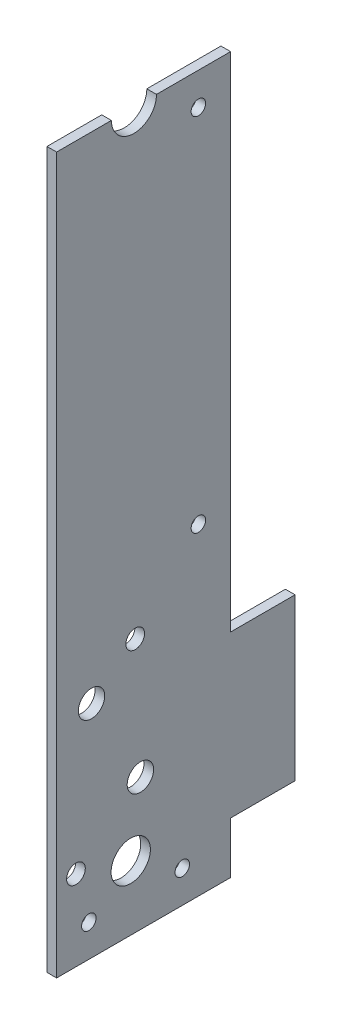
ISO-10303-21;
HEADER;
FILE_DESCRIPTION(('STEP AP214'),'2;1');
FILE_NAME('part.step','',(''),(''),'','','');
FILE_SCHEMA(('AUTOMOTIVE_DESIGN { 1 0 10303 214 1 1 1 1 }'));
ENDSEC;
DATA;
#1=APPLICATION_CONTEXT('core data for automotive mechanical design processes');
#2=APPLICATION_PROTOCOL_DEFINITION('international standard','automotive_design',2000,#1);
#3=PRODUCT_CONTEXT('',#1,'mechanical');
#4=PRODUCT('Part','Part','',(#3));
#5=PRODUCT_RELATED_PRODUCT_CATEGORY('part','',(#4));
#6=PRODUCT_DEFINITION_FORMATION('','',#4);
#7=PRODUCT_DEFINITION_CONTEXT('part definition',#1,'design');
#8=PRODUCT_DEFINITION('design','',#6,#7);
#9=PRODUCT_DEFINITION_SHAPE('','',#8);
#10=(LENGTH_UNIT() NAMED_UNIT(*) SI_UNIT(.MILLI.,.METRE.));
#11=(NAMED_UNIT(*) PLANE_ANGLE_UNIT() SI_UNIT($,.RADIAN.));
#12=(NAMED_UNIT(*) SI_UNIT($,.STERADIAN.) SOLID_ANGLE_UNIT());
#13=UNCERTAINTY_MEASURE_WITH_UNIT(LENGTH_MEASURE(1.E-05),#10,'distance_accuracy_value','');
#14=(GEOMETRIC_REPRESENTATION_CONTEXT(3) GLOBAL_UNCERTAINTY_ASSIGNED_CONTEXT((#13)) GLOBAL_UNIT_ASSIGNED_CONTEXT((#10,
#11,#12)) REPRESENTATION_CONTEXT('',''));
#15=CARTESIAN_POINT('',(0.,0.,0.));
#16=DIRECTION('',(0.,0.,1.));
#17=DIRECTION('',(1.,0.,0.));
#18=AXIS2_PLACEMENT_3D('',#15,#16,#17);
#19=CARTESIAN_POINT('',(0.,52.,24.));
#20=DIRECTION('',(0.,1.,0.));
#21=DIRECTION('',(0.,0.,1.));
#22=AXIS2_PLACEMENT_3D('',#19,#20,#21);
#23=PLANE('',#22);
#24=DIRECTION('',(1.,0.,0.));
#25=VECTOR('',#24,1.);
#26=CARTESIAN_POINT('',(-1.8,52.,61.));
#27=LINE('',#26,#25);
#28=CARTESIAN_POINT('',(-1.5,52.,61.));
#29=VERTEX_POINT('',#28);
#30=CARTESIAN_POINT('',(1.5,52.,61.));
#31=VERTEX_POINT('',#30);
#32=EDGE_CURVE('E30',#29,#31,#27,.T.);
#33=ORIENTED_EDGE('',*,*,#32,.F.);
#34=DIRECTION('',(0.,0.,1.));
#35=VECTOR('',#34,1.);
#36=CARTESIAN_POINT('',(-1.5,52.,24.));
#37=LINE('',#36,#35);
#38=CARTESIAN_POINT('',(-1.5,52.,78.));
#39=VERTEX_POINT('',#38);
#40=EDGE_CURVE('E108',#29,#39,#37,.T.);
#41=ORIENTED_EDGE('',*,*,#40,.T.);
#42=DIRECTION('',(1.,0.,0.));
#43=VECTOR('',#42,1.);
#44=CARTESIAN_POINT('',(0.,52.,78.));
#45=LINE('',#44,#43);
#46=CARTESIAN_POINT('',(1.5,52.,78.));
#47=VERTEX_POINT('',#46);
#48=EDGE_CURVE('E122',#39,#47,#45,.T.);
#49=ORIENTED_EDGE('',*,*,#48,.T.);
#50=DIRECTION('',(0.,0.,1.));
#51=VECTOR('',#50,1.);
#52=CARTESIAN_POINT('',(1.5,52.,24.));
#53=LINE('',#52,#51);
#54=EDGE_CURVE('E109',#31,#47,#53,.T.);
#55=ORIENTED_EDGE('',*,*,#54,.F.);
#56=EDGE_LOOP('',(#33,#41,#49,#55));
#57=FACE_BOUND('',#56,.T.);
#58=ADVANCED_FACE('F16',(#57),#23,.T.);
#59=CARTESIAN_POINT('',(0.,-59.,24.));
#60=DIRECTION('',(0.,0.,-1.));
#61=DIRECTION('',(-1.,0.,0.));
#62=AXIS2_PLACEMENT_3D('',#59,#60,#61);
#63=PLANE('',#62);
#64=DIRECTION('',(-1.,0.,0.));
#65=VECTOR('',#64,1.);
#66=CARTESIAN_POINT('',(0.,-154.,24.));
#67=LINE('',#66,#65);
#68=CARTESIAN_POINT('',(1.5,-154.,24.));
#69=VERTEX_POINT('',#68);
#70=CARTESIAN_POINT('',(-1.5,-154.,24.));
#71=VERTEX_POINT('',#70);
#72=EDGE_CURVE('E208',#69,#71,#67,.T.);
#73=ORIENTED_EDGE('',*,*,#72,.F.);
#74=DIRECTION('',(0.,1.,0.));
#75=VECTOR('',#74,1.);
#76=CARTESIAN_POINT('',(1.5,-59.,24.));
#77=LINE('',#76,#75);
#78=CARTESIAN_POINT('',(1.5,-170.,24.));
#79=VERTEX_POINT('',#78);
#80=EDGE_CURVE('E214',#79,#69,#77,.T.);
#81=ORIENTED_EDGE('',*,*,#80,.F.);
#82=DIRECTION('',(1.,0.,0.));
#83=VECTOR('',#82,1.);
#84=CARTESIAN_POINT('',(0.,-170.,24.));
#85=LINE('',#84,#83);
#86=CARTESIAN_POINT('',(-1.5,-170.,24.));
#87=VERTEX_POINT('',#86);
#88=EDGE_CURVE('E210',#87,#79,#85,.T.);
#89=ORIENTED_EDGE('',*,*,#88,.F.);
#90=DIRECTION('',(0.,-1.,0.));
#91=VECTOR('',#90,1.);
#92=CARTESIAN_POINT('',(-1.5,-59.,24.));
#93=LINE('',#92,#91);
#94=EDGE_CURVE('E213',#71,#87,#93,.T.);
#95=ORIENTED_EDGE('',*,*,#94,.F.);
#96=EDGE_LOOP('',(#73,#81,#89,#95));
#97=FACE_BOUND('',#96,.T.);
#98=ADVANCED_FACE('F234',(#97),#63,.T.);
#99=CARTESIAN_POINT('',(0.,-59.,78.));
#100=DIRECTION('',(0.,0.,1.));
#101=DIRECTION('',(1.,0.,0.));
#102=AXIS2_PLACEMENT_3D('',#99,#100,#101);
#103=PLANE('',#102);
#104=DIRECTION('',(-1.,0.,0.));
#105=VECTOR('',#104,1.);
#106=CARTESIAN_POINT('',(0.,-170.,78.));
#107=LINE('',#106,#105);
#108=CARTESIAN_POINT('',(1.5,-170.,78.));
#109=VERTEX_POINT('',#108);
#110=CARTESIAN_POINT('',(-1.5,-170.,78.));
#111=VERTEX_POINT('',#110);
#112=EDGE_CURVE('E24',#109,#111,#107,.T.);
#113=ORIENTED_EDGE('',*,*,#112,.F.);
#114=DIRECTION('',(0.,-1.,0.));
#115=VECTOR('',#114,1.);
#116=CARTESIAN_POINT('',(1.5,-59.,78.));
#117=LINE('',#116,#115);
#118=EDGE_CURVE('E119',#47,#109,#117,.T.);
#119=ORIENTED_EDGE('',*,*,#118,.F.);
#120=ORIENTED_EDGE('',*,*,#48,.F.);
#121=DIRECTION('',(0.,1.,0.));
#122=VECTOR('',#121,1.);
#123=CARTESIAN_POINT('',(-1.5,-59.,78.));
#124=LINE('',#123,#122);
#125=EDGE_CURVE('E125',#111,#39,#124,.T.);
#126=ORIENTED_EDGE('',*,*,#125,.F.);
#127=EDGE_LOOP('',(#113,#119,#120,#126));
#128=FACE_BOUND('',#127,.T.);
#129=ADVANCED_FACE('F18',(#128),#103,.T.);
#130=CARTESIAN_POINT('',(0.,-170.,24.));
#131=DIRECTION('',(0.,-1.,0.));
#132=DIRECTION('',(0.,0.,-1.));
#133=AXIS2_PLACEMENT_3D('',#130,#131,#132);
#134=PLANE('',#133);
#135=DIRECTION('',(0.,0.,1.));
#136=VECTOR('',#135,1.);
#137=CARTESIAN_POINT('',(1.5,-170.,24.));
#138=LINE('',#137,#136);
#139=EDGE_CURVE('E112',#79,#109,#138,.T.);
#140=ORIENTED_EDGE('',*,*,#139,.T.);
#141=ORIENTED_EDGE('',*,*,#112,.T.);
#142=DIRECTION('',(0.,0.,1.));
#143=VECTOR('',#142,1.);
#144=CARTESIAN_POINT('',(-1.5,-170.,24.));
#145=LINE('',#144,#143);
#146=EDGE_CURVE('E116',#87,#111,#145,.T.);
#147=ORIENTED_EDGE('',*,*,#146,.F.);
#148=ORIENTED_EDGE('',*,*,#88,.T.);
#149=EDGE_LOOP('',(#140,#141,#147,#148));
#150=FACE_BOUND('',#149,.T.);
#151=ADVANCED_FACE('F231',(#150),#134,.T.);
#152=CARTESIAN_POINT('',(-1.5,-59.,24.));
#153=DIRECTION('',(-1.,0.,0.));
#154=DIRECTION('',(0.,0.,1.));
#155=AXIS2_PLACEMENT_3D('',#152,#153,#154);
#156=PLANE('',#155);
#157=CARTESIAN_POINT('',(-1.5,52.,54.));
#158=DIRECTION('',(-1.,0.,0.));
#159=DIRECTION('',(0.,0.,1.));
#160=AXIS2_PLACEMENT_3D('',#157,#158,#159);
#161=CIRCLE('',#160,7.);
#162=CARTESIAN_POINT('',(-1.5,52.,47.));
#163=VERTEX_POINT('',#162);
#164=EDGE_CURVE('E163',#163,#29,#161,.T.);
#165=ORIENTED_EDGE('',*,*,#164,.F.);
#166=CARTESIAN_POINT('',(-1.5,52.,24.));
#167=VERTEX_POINT('',#166);
#168=EDGE_CURVE('E102',#167,#163,#37,.T.);
#169=ORIENTED_EDGE('',*,*,#168,.F.);
#170=CARTESIAN_POINT('',(-1.5,-104.,24.));
#171=VERTEX_POINT('',#170);
#172=EDGE_CURVE('E218',#167,#171,#93,.T.);
#173=ORIENTED_EDGE('',*,*,#172,.T.);
#174=DIRECTION('',(0.,0.,1.));
#175=VECTOR('',#174,1.);
#176=CARTESIAN_POINT('',(-1.5,-104.,4.));
#177=LINE('',#176,#175);
#178=CARTESIAN_POINT('',(-1.5,-104.,4.));
#179=VERTEX_POINT('',#178);
#180=EDGE_CURVE('E201',#179,#171,#177,.T.);
#181=ORIENTED_EDGE('',*,*,#180,.F.);
#182=DIRECTION('',(0.,-1.,0.));
#183=VECTOR('',#182,1.);
#184=CARTESIAN_POINT('',(-1.5,-129.,4.));
#185=LINE('',#184,#183);
#186=CARTESIAN_POINT('',(-1.5,-154.,4.));
#187=VERTEX_POINT('',#186);
#188=EDGE_CURVE('E190',#179,#187,#185,.T.);
#189=ORIENTED_EDGE('',*,*,#188,.T.);
#190=DIRECTION('',(0.,0.,1.));
#191=VECTOR('',#190,1.);
#192=CARTESIAN_POINT('',(-1.5,-154.,4.));
#193=LINE('',#192,#191);
#194=EDGE_CURVE('E203',#187,#71,#193,.T.);
#195=ORIENTED_EDGE('',*,*,#194,.T.);
#196=ORIENTED_EDGE('',*,*,#94,.T.);
#197=ORIENTED_EDGE('',*,*,#146,.T.);
#198=ORIENTED_EDGE('',*,*,#125,.T.);
#199=ORIENTED_EDGE('',*,*,#40,.F.);
#200=EDGE_LOOP('',(#165,#169,#173,#181,#189,#195,#196,#197,#198,#199));
#201=FACE_BOUND('',#200,.T.);
#202=CARTESIAN_POINT('',(-1.5,42.,34.));
#203=DIRECTION('',(-1.,0.,0.));
#204=DIRECTION('',(0.,0.,1.));
#205=AXIS2_PLACEMENT_3D('',#202,#203,#204);
#206=CIRCLE('',#205,2.25);
#207=CARTESIAN_POINT('',(-1.5,42.,36.25));
#208=VERTEX_POINT('',#207);
#209=EDGE_CURVE('E160',#208,#208,#206,.T.);
#210=ORIENTED_EDGE('',*,*,#209,.F.);
#211=EDGE_LOOP('',(#210));
#212=FACE_BOUND('',#211,.T.);
#213=CARTESIAN_POINT('',(-1.5,-70.,34.));
#214=DIRECTION('',(-1.,0.,0.));
#215=DIRECTION('',(0.,0.,1.));
#216=AXIS2_PLACEMENT_3D('',#213,#214,#215);
#217=CIRCLE('',#216,2.25);
#218=CARTESIAN_POINT('',(-1.5,-70.,36.25));
#219=VERTEX_POINT('',#218);
#220=EDGE_CURVE('E157',#219,#219,#217,.T.);
#221=ORIENTED_EDGE('',*,*,#220,.F.);
#222=EDGE_LOOP('',(#221));
#223=FACE_BOUND('',#222,.T.);
#224=CARTESIAN_POINT('',(-1.5,-160.,68.));
#225=DIRECTION('',(-1.,0.,0.));
#226=DIRECTION('',(0.,0.,1.));
#227=AXIS2_PLACEMENT_3D('',#224,#225,#226);
#228=CIRCLE('',#227,2.25);
#229=CARTESIAN_POINT('',(-1.5,-160.,70.25));
#230=VERTEX_POINT('',#229);
#231=EDGE_CURVE('E153',#230,#230,#228,.T.);
#232=ORIENTED_EDGE('',*,*,#231,.F.);
#233=EDGE_LOOP('',(#232));
#234=FACE_BOUND('',#233,.T.);
#235=CARTESIAN_POINT('',(-1.5,-160.,39.));
#236=DIRECTION('',(-1.,0.,0.));
#237=DIRECTION('',(0.,0.,1.));
#238=AXIS2_PLACEMENT_3D('',#235,#236,#237);
#239=CIRCLE('',#238,2.25);
#240=CARTESIAN_POINT('',(-1.5,-160.,41.25));
#241=VERTEX_POINT('',#240);
#242=EDGE_CURVE('E149',#241,#241,#239,.T.);
#243=ORIENTED_EDGE('',*,*,#242,.F.);
#244=EDGE_LOOP('',(#243));
#245=FACE_BOUND('',#244,.T.);
#246=CARTESIAN_POINT('',(-1.5,-145.,72.));
#247=DIRECTION('',(-1.,0.,0.));
#248=DIRECTION('',(0.,0.,1.));
#249=AXIS2_PLACEMENT_3D('',#246,#247,#248);
#250=CIRCLE('',#249,2.9);
#251=CARTESIAN_POINT('',(-1.5,-145.,74.9));
#252=VERTEX_POINT('',#251);
#253=EDGE_CURVE('E145',#252,#252,#250,.T.);
#254=ORIENTED_EDGE('',*,*,#253,.F.);
#255=EDGE_LOOP('',(#254));
#256=FACE_BOUND('',#255,.T.);
#257=CARTESIAN_POINT('',(-1.5,-91.033973073178,53.6064866609543));
#258=DIRECTION('',(-1.,0.,0.));
#259=DIRECTION('',(0.,0.,1.));
#260=AXIS2_PLACEMENT_3D('',#257,#258,#259);
#261=CIRCLE('',#260,2.9);
#262=CARTESIAN_POINT('',(-1.5,-91.033973073178,56.5064866609543));
#263=VERTEX_POINT('',#262);
#264=EDGE_CURVE('E141',#263,#263,#261,.T.);
#265=ORIENTED_EDGE('',*,*,#264,.F.);
#266=EDGE_LOOP('',(#265));
#267=FACE_BOUND('',#266,.T.);
#268=CARTESIAN_POINT('',(-1.5,-101.61689629743,67.1712106179534));
#269=DIRECTION('',(-1.,0.,0.));
#270=DIRECTION('',(0.,0.,1.));
#271=AXIS2_PLACEMENT_3D('',#268,#269,#270);
#272=CIRCLE('',#271,4.1);
#273=CARTESIAN_POINT('',(-1.5,-101.61689629743,71.2712106179534));
#274=VERTEX_POINT('',#273);
#275=EDGE_CURVE('E137',#274,#274,#272,.T.);
#276=ORIENTED_EDGE('',*,*,#275,.F.);
#277=EDGE_LOOP('',(#276));
#278=FACE_BOUND('',#277,.T.);
#279=CARTESIAN_POINT('',(-1.5,-150.,55.));
#280=DIRECTION('',(-1.,0.,0.));
#281=DIRECTION('',(0.,0.,1.));
#282=AXIS2_PLACEMENT_3D('',#279,#280,#281);
#283=CIRCLE('',#282,6.1);
#284=CARTESIAN_POINT('',(-1.5,-150.,61.1));
#285=VERTEX_POINT('',#284);
#286=EDGE_CURVE('E133',#285,#285,#283,.T.);
#287=ORIENTED_EDGE('',*,*,#286,.F.);
#288=EDGE_LOOP('',(#287));
#289=FACE_BOUND('',#288,.T.);
#290=CARTESIAN_POINT('',(-1.5,-129.,52.));
#291=DIRECTION('',(-1.,0.,0.));
#292=DIRECTION('',(0.,0.,1.));
#293=AXIS2_PLACEMENT_3D('',#290,#291,#292);
#294=CIRCLE('',#293,4.1);
#295=CARTESIAN_POINT('',(-1.5,-129.,56.1));
#296=VERTEX_POINT('',#295);
#297=EDGE_CURVE('E132',#296,#296,#294,.T.);
#298=ORIENTED_EDGE('',*,*,#297,.F.);
#299=EDGE_LOOP('',(#298));
#300=FACE_BOUND('',#299,.T.);
#301=ADVANCED_FACE('F224',(#201,#212,#223,#234,#245,#256,#267,#278,#289,#300),#156,.T.);
#302=DIRECTION('',(1.,0.,0.));
#303=VECTOR('',#302,1.);
#304=CARTESIAN_POINT('',(-1.8,52.,47.));
#305=LINE('',#304,#303);
#306=CARTESIAN_POINT('',(1.5,52.,47.));
#307=VERTEX_POINT('',#306);
#308=EDGE_CURVE('E91',#307,#163,#305,.F.);
#309=ORIENTED_EDGE('',*,*,#308,.F.);
#310=CARTESIAN_POINT('',(1.5,52.,24.));
#311=VERTEX_POINT('',#310);
#312=EDGE_CURVE('E100',#311,#307,#53,.T.);
#313=ORIENTED_EDGE('',*,*,#312,.F.);
#314=DIRECTION('',(-1.,0.,0.));
#315=VECTOR('',#314,1.);
#316=CARTESIAN_POINT('',(0.,52.,24.));
#317=LINE('',#316,#315);
#318=EDGE_CURVE('E217',#311,#167,#317,.T.);
#319=ORIENTED_EDGE('',*,*,#318,.T.);
#320=ORIENTED_EDGE('',*,*,#168,.T.);
#321=EDGE_LOOP('',(#309,#313,#319,#320));
#322=FACE_BOUND('',#321,.T.);
#323=ADVANCED_FACE('F98',(#322),#23,.T.);
#324=DIRECTION('',(1.,0.,0.));
#325=VECTOR('',#324,1.);
#326=CARTESIAN_POINT('',(0.,-104.,24.));
#327=LINE('',#326,#325);
#328=CARTESIAN_POINT('',(1.5,-104.,24.));
#329=VERTEX_POINT('',#328);
#330=EDGE_CURVE('E206',#171,#329,#327,.T.);
#331=ORIENTED_EDGE('',*,*,#330,.F.);
#332=ORIENTED_EDGE('',*,*,#172,.F.);
#333=ORIENTED_EDGE('',*,*,#318,.F.);
#334=EDGE_CURVE('E107',#329,#311,#77,.T.);
#335=ORIENTED_EDGE('',*,*,#334,.F.);
#336=EDGE_LOOP('',(#331,#332,#333,#335));
#337=FACE_BOUND('',#336,.T.);
#338=ADVANCED_FACE('F247',(#337),#63,.T.);
#339=CARTESIAN_POINT('',(1.5,-59.,24.));
#340=DIRECTION('',(1.,0.,0.));
#341=DIRECTION('',(0.,0.,-1.));
#342=AXIS2_PLACEMENT_3D('',#339,#340,#341);
#343=PLANE('',#342);
#344=CARTESIAN_POINT('',(1.5,52.,54.));
#345=DIRECTION('',(1.,0.,0.));
#346=DIRECTION('',(0.,0.,-1.));
#347=AXIS2_PLACEMENT_3D('',#344,#345,#346);
#348=CIRCLE('',#347,7.);
#349=EDGE_CURVE('E10',#31,#307,#348,.T.);
#350=ORIENTED_EDGE('',*,*,#349,.F.);
#351=ORIENTED_EDGE('',*,*,#54,.T.);
#352=ORIENTED_EDGE('',*,*,#118,.T.);
#353=ORIENTED_EDGE('',*,*,#139,.F.);
#354=ORIENTED_EDGE('',*,*,#80,.T.);
#355=DIRECTION('',(0.,0.,1.));
#356=VECTOR('',#355,1.);
#357=CARTESIAN_POINT('',(1.5,-154.,4.));
#358=LINE('',#357,#356);
#359=CARTESIAN_POINT('',(1.5,-154.,4.));
#360=VERTEX_POINT('',#359);
#361=EDGE_CURVE('E193',#360,#69,#358,.T.);
#362=ORIENTED_EDGE('',*,*,#361,.F.);
#363=DIRECTION('',(0.,1.,0.));
#364=VECTOR('',#363,1.);
#365=CARTESIAN_POINT('',(1.5,-129.,4.));
#366=LINE('',#365,#364);
#367=CARTESIAN_POINT('',(1.5,-104.,4.));
#368=VERTEX_POINT('',#367);
#369=EDGE_CURVE('E191',#360,#368,#366,.T.);
#370=ORIENTED_EDGE('',*,*,#369,.T.);
#371=DIRECTION('',(0.,0.,1.));
#372=VECTOR('',#371,1.);
#373=CARTESIAN_POINT('',(1.5,-104.,4.));
#374=LINE('',#373,#372);
#375=EDGE_CURVE('E38',#368,#329,#374,.T.);
#376=ORIENTED_EDGE('',*,*,#375,.T.);
#377=ORIENTED_EDGE('',*,*,#334,.T.);
#378=ORIENTED_EDGE('',*,*,#312,.T.);
#379=EDGE_LOOP('',(#350,#351,#352,#353,#354,#362,#370,#376,#377,#378));
#380=FACE_BOUND('',#379,.T.);
#381=CARTESIAN_POINT('',(1.5,42.,34.));
#382=DIRECTION('',(1.,0.,0.));
#383=DIRECTION('',(0.,0.,-1.));
#384=AXIS2_PLACEMENT_3D('',#381,#382,#383);
#385=CIRCLE('',#384,2.25);
#386=CARTESIAN_POINT('',(1.5,42.,31.75));
#387=VERTEX_POINT('',#386);
#388=EDGE_CURVE('E161',#387,#387,#385,.T.);
#389=ORIENTED_EDGE('',*,*,#388,.F.);
#390=EDGE_LOOP('',(#389));
#391=FACE_BOUND('',#390,.T.);
#392=CARTESIAN_POINT('',(1.5,-70.,34.));
#393=DIRECTION('',(1.,0.,0.));
#394=DIRECTION('',(0.,0.,-1.));
#395=AXIS2_PLACEMENT_3D('',#392,#393,#394);
#396=CIRCLE('',#395,2.25);
#397=CARTESIAN_POINT('',(1.5,-70.,31.75));
#398=VERTEX_POINT('',#397);
#399=EDGE_CURVE('E158',#398,#398,#396,.T.);
#400=ORIENTED_EDGE('',*,*,#399,.F.);
#401=EDGE_LOOP('',(#400));
#402=FACE_BOUND('',#401,.T.);
#403=CARTESIAN_POINT('',(1.5,-160.,68.));
#404=DIRECTION('',(1.,0.,0.));
#405=DIRECTION('',(0.,0.,-1.));
#406=AXIS2_PLACEMENT_3D('',#403,#404,#405);
#407=CIRCLE('',#406,2.25);
#408=CARTESIAN_POINT('',(1.5,-160.,65.75));
#409=VERTEX_POINT('',#408);
#410=EDGE_CURVE('E154',#409,#409,#407,.T.);
#411=ORIENTED_EDGE('',*,*,#410,.F.);
#412=EDGE_LOOP('',(#411));
#413=FACE_BOUND('',#412,.T.);
#414=CARTESIAN_POINT('',(1.5,-160.,39.));
#415=DIRECTION('',(1.,0.,0.));
#416=DIRECTION('',(0.,0.,-1.));
#417=AXIS2_PLACEMENT_3D('',#414,#415,#416);
#418=CIRCLE('',#417,2.25);
#419=CARTESIAN_POINT('',(1.5,-160.,36.75));
#420=VERTEX_POINT('',#419);
#421=EDGE_CURVE('E150',#420,#420,#418,.T.);
#422=ORIENTED_EDGE('',*,*,#421,.F.);
#423=EDGE_LOOP('',(#422));
#424=FACE_BOUND('',#423,.T.);
#425=CARTESIAN_POINT('',(1.5,-145.,72.));
#426=DIRECTION('',(1.,0.,0.));
#427=DIRECTION('',(0.,0.,-1.));
#428=AXIS2_PLACEMENT_3D('',#425,#426,#427);
#429=CIRCLE('',#428,2.9);
#430=CARTESIAN_POINT('',(1.5,-145.,69.1));
#431=VERTEX_POINT('',#430);
#432=EDGE_CURVE('E146',#431,#431,#429,.T.);
#433=ORIENTED_EDGE('',*,*,#432,.F.);
#434=EDGE_LOOP('',(#433));
#435=FACE_BOUND('',#434,.T.);
#436=CARTESIAN_POINT('',(1.5,-91.033973073178,53.6064866609543));
#437=DIRECTION('',(1.,0.,0.));
#438=DIRECTION('',(0.,0.,-1.));
#439=AXIS2_PLACEMENT_3D('',#436,#437,#438);
#440=CIRCLE('',#439,2.9);
#441=CARTESIAN_POINT('',(1.5,-91.033973073178,50.7064866609543));
#442=VERTEX_POINT('',#441);
#443=EDGE_CURVE('E142',#442,#442,#440,.T.);
#444=ORIENTED_EDGE('',*,*,#443,.F.);
#445=EDGE_LOOP('',(#444));
#446=FACE_BOUND('',#445,.T.);
#447=CARTESIAN_POINT('',(1.5,-101.61689629743,67.1712106179534));
#448=DIRECTION('',(1.,0.,0.));
#449=DIRECTION('',(0.,0.,-1.));
#450=AXIS2_PLACEMENT_3D('',#447,#448,#449);
#451=CIRCLE('',#450,4.1);
#452=CARTESIAN_POINT('',(1.5,-101.61689629743,63.0712106179534));
#453=VERTEX_POINT('',#452);
#454=EDGE_CURVE('E138',#453,#453,#451,.T.);
#455=ORIENTED_EDGE('',*,*,#454,.F.);
#456=EDGE_LOOP('',(#455));
#457=FACE_BOUND('',#456,.T.);
#458=CARTESIAN_POINT('',(1.5,-150.,55.));
#459=DIRECTION('',(1.,0.,0.));
#460=DIRECTION('',(0.,0.,-1.));
#461=AXIS2_PLACEMENT_3D('',#458,#459,#460);
#462=CIRCLE('',#461,6.1);
#463=CARTESIAN_POINT('',(1.5,-150.,48.9));
#464=VERTEX_POINT('',#463);
#465=EDGE_CURVE('E134',#464,#464,#462,.T.);
#466=ORIENTED_EDGE('',*,*,#465,.F.);
#467=EDGE_LOOP('',(#466));
#468=FACE_BOUND('',#467,.T.);
#469=CARTESIAN_POINT('',(1.5,-129.,52.));
#470=DIRECTION('',(1.,0.,0.));
#471=DIRECTION('',(0.,0.,-1.));
#472=AXIS2_PLACEMENT_3D('',#469,#470,#471);
#473=CIRCLE('',#472,4.1);
#474=CARTESIAN_POINT('',(1.5,-129.,47.9));
#475=VERTEX_POINT('',#474);
#476=EDGE_CURVE('E129',#475,#475,#473,.T.);
#477=ORIENTED_EDGE('',*,*,#476,.F.);
#478=EDGE_LOOP('',(#477));
#479=FACE_BOUND('',#478,.T.);
#480=ADVANCED_FACE('F104',(#380,#391,#402,#413,#424,#435,#446,#457,#468,#479),#343,.T.);
#481=CARTESIAN_POINT('',(0.,-154.,4.));
#482=DIRECTION('',(0.,-1.,0.));
#483=DIRECTION('',(0.,0.,-1.));
#484=AXIS2_PLACEMENT_3D('',#481,#482,#483);
#485=PLANE('',#484);
#486=ORIENTED_EDGE('',*,*,#361,.T.);
#487=ORIENTED_EDGE('',*,*,#72,.T.);
#488=ORIENTED_EDGE('',*,*,#194,.F.);
#489=DIRECTION('',(1.,0.,0.));
#490=VECTOR('',#489,1.);
#491=CARTESIAN_POINT('',(0.,-154.,4.));
#492=LINE('',#491,#490);
#493=EDGE_CURVE('E187',#187,#360,#492,.T.);
#494=ORIENTED_EDGE('',*,*,#493,.T.);
#495=EDGE_LOOP('',(#486,#487,#488,#494));
#496=FACE_BOUND('',#495,.T.);
#497=ADVANCED_FACE('F308',(#496),#485,.T.);
#498=CARTESIAN_POINT('',(0.,-104.,4.));
#499=DIRECTION('',(0.,1.,0.));
#500=DIRECTION('',(0.,0.,1.));
#501=AXIS2_PLACEMENT_3D('',#498,#499,#500);
#502=PLANE('',#501);
#503=ORIENTED_EDGE('',*,*,#180,.T.);
#504=ORIENTED_EDGE('',*,*,#330,.T.);
#505=ORIENTED_EDGE('',*,*,#375,.F.);
#506=DIRECTION('',(-1.,0.,0.));
#507=VECTOR('',#506,1.);
#508=CARTESIAN_POINT('',(0.,-104.,4.));
#509=LINE('',#508,#507);
#510=EDGE_CURVE('E194',#368,#179,#509,.T.);
#511=ORIENTED_EDGE('',*,*,#510,.T.);
#512=EDGE_LOOP('',(#503,#504,#505,#511));
#513=FACE_BOUND('',#512,.T.);
#514=ADVANCED_FACE('F315',(#513),#502,.T.);
#515=CARTESIAN_POINT('',(0.,-129.,4.));
#516=DIRECTION('',(0.,0.,-1.));
#517=DIRECTION('',(-1.,0.,0.));
#518=AXIS2_PLACEMENT_3D('',#515,#516,#517);
#519=PLANE('',#518);
#520=ORIENTED_EDGE('',*,*,#369,.F.);
#521=ORIENTED_EDGE('',*,*,#493,.F.);
#522=ORIENTED_EDGE('',*,*,#188,.F.);
#523=ORIENTED_EDGE('',*,*,#510,.F.);
#524=EDGE_LOOP('',(#520,#521,#522,#523));
#525=FACE_BOUND('',#524,.T.);
#526=ADVANCED_FACE('F324',(#525),#519,.T.);
#527=CARTESIAN_POINT('',(-1.8,-129.,52.));
#528=DIRECTION('',(1.,0.,0.));
#529=DIRECTION('',(0.,0.,-1.));
#530=AXIS2_PLACEMENT_3D('',#527,#528,#529);
#531=CYLINDRICAL_SURFACE('',#530,4.1);
#532=ORIENTED_EDGE('',*,*,#297,.T.);
#533=EDGE_LOOP('',(#532));
#534=FACE_BOUND('',#533,.T.);
#535=ORIENTED_EDGE('',*,*,#476,.T.);
#536=EDGE_LOOP('',(#535));
#537=FACE_BOUND('',#536,.T.);
#538=ADVANCED_FACE('F333',(#534,#537),#531,.F.);
#539=CARTESIAN_POINT('',(-1.8,-150.,55.));
#540=DIRECTION('',(1.,0.,0.));
#541=DIRECTION('',(0.,0.,-1.));
#542=AXIS2_PLACEMENT_3D('',#539,#540,#541);
#543=CYLINDRICAL_SURFACE('',#542,6.1);
#544=ORIENTED_EDGE('',*,*,#286,.T.);
#545=EDGE_LOOP('',(#544));
#546=FACE_BOUND('',#545,.T.);
#547=ORIENTED_EDGE('',*,*,#465,.T.);
#548=EDGE_LOOP('',(#547));
#549=FACE_BOUND('',#548,.T.);
#550=ADVANCED_FACE('F342',(#546,#549),#543,.F.);
#551=CARTESIAN_POINT('',(-1.8,-101.61689629743,67.1712106179534));
#552=DIRECTION('',(1.,0.,0.));
#553=DIRECTION('',(0.,0.,-1.));
#554=AXIS2_PLACEMENT_3D('',#551,#552,#553);
#555=CYLINDRICAL_SURFACE('',#554,4.1);
#556=ORIENTED_EDGE('',*,*,#275,.T.);
#557=EDGE_LOOP('',(#556));
#558=FACE_BOUND('',#557,.T.);
#559=ORIENTED_EDGE('',*,*,#454,.T.);
#560=EDGE_LOOP('',(#559));
#561=FACE_BOUND('',#560,.T.);
#562=ADVANCED_FACE('F351',(#558,#561),#555,.F.);
#563=CARTESIAN_POINT('',(-1.8,-91.033973073178,53.6064866609543));
#564=DIRECTION('',(1.,0.,0.));
#565=DIRECTION('',(0.,0.,-1.));
#566=AXIS2_PLACEMENT_3D('',#563,#564,#565);
#567=CYLINDRICAL_SURFACE('',#566,2.9);
#568=ORIENTED_EDGE('',*,*,#264,.T.);
#569=EDGE_LOOP('',(#568));
#570=FACE_BOUND('',#569,.T.);
#571=ORIENTED_EDGE('',*,*,#443,.T.);
#572=EDGE_LOOP('',(#571));
#573=FACE_BOUND('',#572,.T.);
#574=ADVANCED_FACE('F360',(#570,#573),#567,.F.);
#575=CARTESIAN_POINT('',(-1.8,-145.,72.));
#576=DIRECTION('',(1.,0.,0.));
#577=DIRECTION('',(0.,0.,-1.));
#578=AXIS2_PLACEMENT_3D('',#575,#576,#577);
#579=CYLINDRICAL_SURFACE('',#578,2.9);
#580=ORIENTED_EDGE('',*,*,#253,.T.);
#581=EDGE_LOOP('',(#580));
#582=FACE_BOUND('',#581,.T.);
#583=ORIENTED_EDGE('',*,*,#432,.T.);
#584=EDGE_LOOP('',(#583));
#585=FACE_BOUND('',#584,.T.);
#586=ADVANCED_FACE('F369',(#582,#585),#579,.F.);
#587=CARTESIAN_POINT('',(-1.8,-160.,39.));
#588=DIRECTION('',(1.,0.,0.));
#589=DIRECTION('',(0.,0.,-1.));
#590=AXIS2_PLACEMENT_3D('',#587,#588,#589);
#591=CYLINDRICAL_SURFACE('',#590,2.25);
#592=ORIENTED_EDGE('',*,*,#242,.T.);
#593=EDGE_LOOP('',(#592));
#594=FACE_BOUND('',#593,.T.);
#595=ORIENTED_EDGE('',*,*,#421,.T.);
#596=EDGE_LOOP('',(#595));
#597=FACE_BOUND('',#596,.T.);
#598=ADVANCED_FACE('F378',(#594,#597),#591,.F.);
#599=CARTESIAN_POINT('',(-1.8,-160.,68.));
#600=DIRECTION('',(1.,0.,0.));
#601=DIRECTION('',(0.,0.,-1.));
#602=AXIS2_PLACEMENT_3D('',#599,#600,#601);
#603=CYLINDRICAL_SURFACE('',#602,2.25);
#604=ORIENTED_EDGE('',*,*,#231,.T.);
#605=EDGE_LOOP('',(#604));
#606=FACE_BOUND('',#605,.T.);
#607=ORIENTED_EDGE('',*,*,#410,.T.);
#608=EDGE_LOOP('',(#607));
#609=FACE_BOUND('',#608,.T.);
#610=ADVANCED_FACE('F387',(#606,#609),#603,.F.);
#611=CARTESIAN_POINT('',(-1.8,-70.,34.));
#612=DIRECTION('',(1.,0.,0.));
#613=DIRECTION('',(0.,0.,-1.));
#614=AXIS2_PLACEMENT_3D('',#611,#612,#613);
#615=CYLINDRICAL_SURFACE('',#614,2.25);
#616=ORIENTED_EDGE('',*,*,#220,.T.);
#617=EDGE_LOOP('',(#616));
#618=FACE_BOUND('',#617,.T.);
#619=ORIENTED_EDGE('',*,*,#399,.T.);
#620=EDGE_LOOP('',(#619));
#621=FACE_BOUND('',#620,.T.);
#622=ADVANCED_FACE('F396',(#618,#621),#615,.F.);
#623=CARTESIAN_POINT('',(-1.8,42.,34.));
#624=DIRECTION('',(1.,0.,0.));
#625=DIRECTION('',(0.,0.,-1.));
#626=AXIS2_PLACEMENT_3D('',#623,#624,#625);
#627=CYLINDRICAL_SURFACE('',#626,2.25);
#628=ORIENTED_EDGE('',*,*,#209,.T.);
#629=EDGE_LOOP('',(#628));
#630=FACE_BOUND('',#629,.T.);
#631=ORIENTED_EDGE('',*,*,#388,.T.);
#632=EDGE_LOOP('',(#631));
#633=FACE_BOUND('',#632,.T.);
#634=ADVANCED_FACE('F405',(#630,#633),#627,.F.);
#635=CARTESIAN_POINT('',(-1.8,52.,54.));
#636=DIRECTION('',(1.,0.,0.));
#637=DIRECTION('',(0.,0.,-1.));
#638=AXIS2_PLACEMENT_3D('',#635,#636,#637);
#639=CYLINDRICAL_SURFACE('',#638,7.);
#640=ORIENTED_EDGE('',*,*,#164,.T.);
#641=ORIENTED_EDGE('',*,*,#32,.T.);
#642=ORIENTED_EDGE('',*,*,#349,.T.);
#643=ORIENTED_EDGE('',*,*,#308,.T.);
#644=EDGE_LOOP('',(#640,#641,#642,#643));
#645=FACE_BOUND('',#644,.T.);
#646=ADVANCED_FACE('F90',(#645),#639,.F.);
#647=CLOSED_SHELL('',(#58,#98,#129,#151,#301,#323,#338,#480,#497,#514,#526,#538,#550,#562,#574,
#586,#598,#610,#622,#634,#646));
#648=MANIFOLD_SOLID_BREP('B1',#647);
#649=ADVANCED_BREP_SHAPE_REPRESENTATION('',(#18,#648),#14);
#650=SHAPE_DEFINITION_REPRESENTATION(#9,#649);
ENDSEC;
END-ISO-10303-21;
